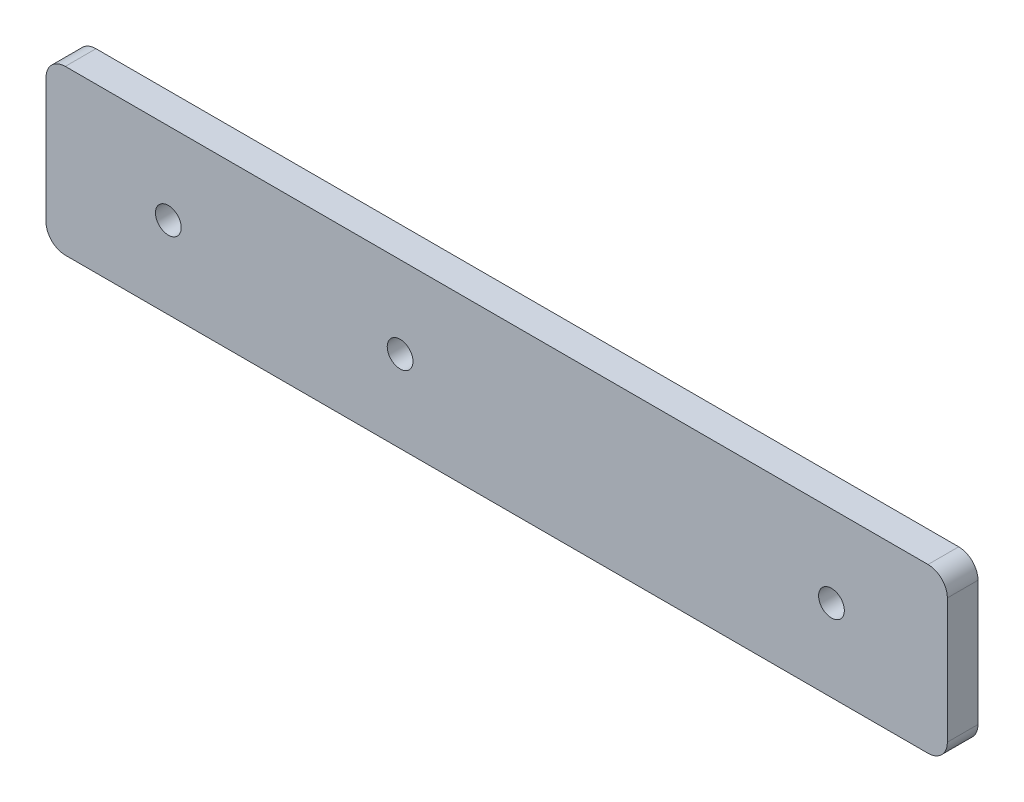
ISO-10303-21;
HEADER;
FILE_DESCRIPTION(('STEP AP214'),'2;1');
FILE_NAME('part.step','',(''),(''),'','','');
FILE_SCHEMA(('AUTOMOTIVE_DESIGN { 1 0 10303 214 1 1 1 1 }'));
ENDSEC;
DATA;
#1=APPLICATION_CONTEXT('core data for automotive mechanical design processes');
#2=APPLICATION_PROTOCOL_DEFINITION('international standard','automotive_design',2000,#1);
#3=PRODUCT_CONTEXT('',#1,'mechanical');
#4=PRODUCT('Part','Part','',(#3));
#5=PRODUCT_RELATED_PRODUCT_CATEGORY('part','',(#4));
#6=PRODUCT_DEFINITION_FORMATION('','',#4);
#7=PRODUCT_DEFINITION_CONTEXT('part definition',#1,'design');
#8=PRODUCT_DEFINITION('design','',#6,#7);
#9=PRODUCT_DEFINITION_SHAPE('','',#8);
#10=(LENGTH_UNIT() NAMED_UNIT(*) SI_UNIT(.MILLI.,.METRE.));
#11=(NAMED_UNIT(*) PLANE_ANGLE_UNIT() SI_UNIT($,.RADIAN.));
#12=(NAMED_UNIT(*) SI_UNIT($,.STERADIAN.) SOLID_ANGLE_UNIT());
#13=UNCERTAINTY_MEASURE_WITH_UNIT(LENGTH_MEASURE(1.E-05),#10,'distance_accuracy_value','');
#14=(GEOMETRIC_REPRESENTATION_CONTEXT(3) GLOBAL_UNCERTAINTY_ASSIGNED_CONTEXT((#13)) GLOBAL_UNIT_ASSIGNED_CONTEXT((#10,
#11,#12)) REPRESENTATION_CONTEXT('',''));
#15=CARTESIAN_POINT('',(0.,0.,0.));
#16=DIRECTION('',(0.,0.,1.));
#17=DIRECTION('',(1.,0.,0.));
#18=AXIS2_PLACEMENT_3D('',#15,#16,#17);
#19=CARTESIAN_POINT('',(0.,0.,3.));
#20=DIRECTION('',(0.,0.,-1.));
#21=DIRECTION('',(-1.,0.,0.));
#22=AXIS2_PLACEMENT_3D('',#19,#20,#21);
#23=PLANE('',#22);
#24=CARTESIAN_POINT('',(52.,0.,3.));
#25=DIRECTION('',(0.,0.,-1.));
#26=DIRECTION('',(-1.,0.,0.));
#27=AXIS2_PLACEMENT_3D('',#24,#25,#26);
#28=CIRCLE('',#27,2.);
#29=CARTESIAN_POINT('',(50.,0.,3.));
#30=VERTEX_POINT('',#29);
#31=EDGE_CURVE('E134',#30,#30,#28,.T.);
#32=ORIENTED_EDGE('',*,*,#31,.T.);
#33=EDGE_LOOP('',(#32));
#34=FACE_BOUND('',#33,.T.);
#35=CARTESIAN_POINT('',(-15.,0.,3.));
#36=DIRECTION('',(0.,0.,-1.));
#37=DIRECTION('',(-1.,0.,0.));
#38=AXIS2_PLACEMENT_3D('',#35,#36,#37);
#39=CIRCLE('',#38,2.);
#40=CARTESIAN_POINT('',(-17.,0.,3.));
#41=VERTEX_POINT('',#40);
#42=EDGE_CURVE('E137',#41,#41,#39,.T.);
#43=ORIENTED_EDGE('',*,*,#42,.T.);
#44=EDGE_LOOP('',(#43));
#45=FACE_BOUND('',#44,.T.);
#46=CARTESIAN_POINT('',(-51.,0.,3.));
#47=DIRECTION('',(0.,0.,-1.));
#48=DIRECTION('',(-1.,0.,0.));
#49=AXIS2_PLACEMENT_3D('',#46,#47,#48);
#50=CIRCLE('',#49,2.);
#51=CARTESIAN_POINT('',(-53.,0.,3.));
#52=VERTEX_POINT('',#51);
#53=EDGE_CURVE('E140',#52,#52,#50,.T.);
#54=ORIENTED_EDGE('',*,*,#53,.T.);
#55=EDGE_LOOP('',(#54));
#56=FACE_BOUND('',#55,.T.);
#57=CARTESIAN_POINT('',(67.,-9.7,3.));
#58=DIRECTION('',(0.,0.,1.));
#59=DIRECTION('',(1.,0.,0.));
#60=AXIS2_PLACEMENT_3D('',#57,#58,#59);
#61=CIRCLE('',#60,3.);
#62=CARTESIAN_POINT('',(70.,-9.7,3.));
#63=VERTEX_POINT('',#62);
#64=CARTESIAN_POINT('',(67.,-12.7,3.));
#65=VERTEX_POINT('',#64);
#66=EDGE_CURVE('E19',#63,#65,#61,.F.);
#67=ORIENTED_EDGE('',*,*,#66,.F.);
#68=DIRECTION('',(0.,1.,0.));
#69=VECTOR('',#68,1.);
#70=CARTESIAN_POINT('',(70.,-12.7,3.));
#71=LINE('',#70,#69);
#72=CARTESIAN_POINT('',(70.,9.7,3.));
#73=VERTEX_POINT('',#72);
#74=EDGE_CURVE('E77',#63,#73,#71,.T.);
#75=ORIENTED_EDGE('',*,*,#74,.T.);
#76=CARTESIAN_POINT('',(67.,9.7,3.));
#77=DIRECTION('',(0.,0.,1.));
#78=DIRECTION('',(1.,0.,0.));
#79=AXIS2_PLACEMENT_3D('',#76,#77,#78);
#80=CIRCLE('',#79,3.);
#81=CARTESIAN_POINT('',(67.,12.7,3.));
#82=VERTEX_POINT('',#81);
#83=EDGE_CURVE('E144',#82,#73,#80,.F.);
#84=ORIENTED_EDGE('',*,*,#83,.F.);
#85=DIRECTION('',(1.,0.,0.));
#86=VECTOR('',#85,1.);
#87=CARTESIAN_POINT('',(-70.,12.7,3.));
#88=LINE('',#87,#86);
#89=CARTESIAN_POINT('',(-67.,12.7,3.));
#90=VERTEX_POINT('',#89);
#91=EDGE_CURVE('E108',#82,#90,#88,.F.);
#92=ORIENTED_EDGE('',*,*,#91,.T.);
#93=CARTESIAN_POINT('',(-67.,9.7,3.));
#94=DIRECTION('',(0.,0.,1.));
#95=DIRECTION('',(1.,0.,0.));
#96=AXIS2_PLACEMENT_3D('',#93,#94,#95);
#97=CIRCLE('',#96,3.);
#98=CARTESIAN_POINT('',(-70.,9.7,3.));
#99=VERTEX_POINT('',#98);
#100=EDGE_CURVE('E111',#99,#90,#97,.F.);
#101=ORIENTED_EDGE('',*,*,#100,.F.);
#102=DIRECTION('',(0.,1.,0.));
#103=VECTOR('',#102,1.);
#104=CARTESIAN_POINT('',(-70.,-12.7,3.));
#105=LINE('',#104,#103);
#106=CARTESIAN_POINT('',(-70.,-9.7,3.));
#107=VERTEX_POINT('',#106);
#108=EDGE_CURVE('E112',#99,#107,#105,.F.);
#109=ORIENTED_EDGE('',*,*,#108,.T.);
#110=CARTESIAN_POINT('',(-67.,-9.7,3.));
#111=DIRECTION('',(0.,0.,1.));
#112=DIRECTION('',(1.,0.,0.));
#113=AXIS2_PLACEMENT_3D('',#110,#111,#112);
#114=CIRCLE('',#113,3.);
#115=CARTESIAN_POINT('',(-67.,-12.7,3.));
#116=VERTEX_POINT('',#115);
#117=EDGE_CURVE('E86',#116,#107,#114,.F.);
#118=ORIENTED_EDGE('',*,*,#117,.F.);
#119=DIRECTION('',(1.,0.,0.));
#120=VECTOR('',#119,1.);
#121=CARTESIAN_POINT('',(-70.,-12.7,3.));
#122=LINE('',#121,#120);
#123=EDGE_CURVE('E82',#116,#65,#122,.T.);
#124=ORIENTED_EDGE('',*,*,#123,.T.);
#125=EDGE_LOOP('',(#67,#75,#84,#92,#101,#109,#118,#124));
#126=FACE_BOUND('',#125,.T.);
#127=ADVANCED_FACE('F16',(#34,#45,#56,#126),#23,.F.);
#128=CARTESIAN_POINT('',(70.,-12.7,3.));
#129=DIRECTION('',(-1.,0.,0.));
#130=DIRECTION('',(0.,0.,1.));
#131=AXIS2_PLACEMENT_3D('',#128,#129,#130);
#132=PLANE('',#131);
#133=DIRECTION('',(0.,0.,1.));
#134=VECTOR('',#133,1.);
#135=CARTESIAN_POINT('',(70.,-9.7,3.));
#136=LINE('',#135,#134);
#137=CARTESIAN_POINT('',(70.,-9.7,-1.76));
#138=VERTEX_POINT('',#137);
#139=EDGE_CURVE('E96',#138,#63,#136,.T.);
#140=ORIENTED_EDGE('',*,*,#139,.F.);
#141=DIRECTION('',(0.,1.,0.));
#142=VECTOR('',#141,1.);
#143=CARTESIAN_POINT('',(70.,0.,-1.76));
#144=LINE('',#143,#142);
#145=CARTESIAN_POINT('',(70.,9.7,-1.76));
#146=VERTEX_POINT('',#145);
#147=EDGE_CURVE('E133',#146,#138,#144,.F.);
#148=ORIENTED_EDGE('',*,*,#147,.F.);
#149=DIRECTION('',(0.,0.,1.));
#150=VECTOR('',#149,1.);
#151=CARTESIAN_POINT('',(70.,9.7,3.));
#152=LINE('',#151,#150);
#153=EDGE_CURVE('E143',#73,#146,#152,.F.);
#154=ORIENTED_EDGE('',*,*,#153,.F.);
#155=ORIENTED_EDGE('',*,*,#74,.F.);
#156=EDGE_LOOP('',(#140,#148,#154,#155));
#157=FACE_BOUND('',#156,.T.);
#158=ADVANCED_FACE('F180',(#157),#132,.F.);
#159=CARTESIAN_POINT('',(67.,-9.7,3.));
#160=DIRECTION('',(0.,0.,1.));
#161=DIRECTION('',(1.,0.,0.));
#162=AXIS2_PLACEMENT_3D('',#159,#160,#161);
#163=CYLINDRICAL_SURFACE('',#162,3.);
#164=ORIENTED_EDGE('',*,*,#66,.T.);
#165=DIRECTION('',(0.,0.,1.));
#166=VECTOR('',#165,1.);
#167=CARTESIAN_POINT('',(67.,-12.7,3.));
#168=LINE('',#167,#166);
#169=CARTESIAN_POINT('',(67.,-12.7,-1.76));
#170=VERTEX_POINT('',#169);
#171=EDGE_CURVE('E90',#65,#170,#168,.F.);
#172=ORIENTED_EDGE('',*,*,#171,.T.);
#173=CARTESIAN_POINT('',(67.,-9.7,-1.76));
#174=DIRECTION('',(0.,0.,1.));
#175=DIRECTION('',(1.,0.,0.));
#176=AXIS2_PLACEMENT_3D('',#173,#174,#175);
#177=CIRCLE('',#176,3.);
#178=EDGE_CURVE('E131',#138,#170,#177,.F.);
#179=ORIENTED_EDGE('',*,*,#178,.F.);
#180=ORIENTED_EDGE('',*,*,#139,.T.);
#181=EDGE_LOOP('',(#164,#172,#179,#180));
#182=FACE_BOUND('',#181,.T.);
#183=ADVANCED_FACE('F93',(#182),#163,.T.);
#184=CARTESIAN_POINT('',(-70.,-12.7,3.));
#185=DIRECTION('',(0.,1.,0.));
#186=DIRECTION('',(0.,0.,1.));
#187=AXIS2_PLACEMENT_3D('',#184,#185,#186);
#188=PLANE('',#187);
#189=ORIENTED_EDGE('',*,*,#171,.F.);
#190=ORIENTED_EDGE('',*,*,#123,.F.);
#191=DIRECTION('',(0.,0.,1.));
#192=VECTOR('',#191,1.);
#193=CARTESIAN_POINT('',(-67.,-12.7,3.));
#194=LINE('',#193,#192);
#195=CARTESIAN_POINT('',(-67.,-12.7,-1.76));
#196=VERTEX_POINT('',#195);
#197=EDGE_CURVE('E101',#196,#116,#194,.T.);
#198=ORIENTED_EDGE('',*,*,#197,.F.);
#199=DIRECTION('',(-1.,0.,0.));
#200=VECTOR('',#199,1.);
#201=CARTESIAN_POINT('',(0.,-12.7,-1.76));
#202=LINE('',#201,#200);
#203=EDGE_CURVE('E99',#170,#196,#202,.T.);
#204=ORIENTED_EDGE('',*,*,#203,.F.);
#205=EDGE_LOOP('',(#189,#190,#198,#204));
#206=FACE_BOUND('',#205,.T.);
#207=ADVANCED_FACE('F97',(#206),#188,.F.);
#208=CARTESIAN_POINT('',(-67.,-9.7,3.));
#209=DIRECTION('',(0.,0.,1.));
#210=DIRECTION('',(1.,0.,0.));
#211=AXIS2_PLACEMENT_3D('',#208,#209,#210);
#212=CYLINDRICAL_SURFACE('',#211,3.);
#213=ORIENTED_EDGE('',*,*,#117,.T.);
#214=DIRECTION('',(0.,0.,-1.));
#215=VECTOR('',#214,1.);
#216=CARTESIAN_POINT('',(-70.,-9.7,3.));
#217=LINE('',#216,#215);
#218=CARTESIAN_POINT('',(-70.,-9.7,-1.76));
#219=VERTEX_POINT('',#218);
#220=EDGE_CURVE('E113',#107,#219,#217,.T.);
#221=ORIENTED_EDGE('',*,*,#220,.T.);
#222=CARTESIAN_POINT('',(-67.,-9.7,-1.76));
#223=DIRECTION('',(0.,0.,1.));
#224=DIRECTION('',(1.,0.,0.));
#225=AXIS2_PLACEMENT_3D('',#222,#223,#224);
#226=CIRCLE('',#225,3.);
#227=EDGE_CURVE('E128',#196,#219,#226,.F.);
#228=ORIENTED_EDGE('',*,*,#227,.F.);
#229=ORIENTED_EDGE('',*,*,#197,.T.);
#230=EDGE_LOOP('',(#213,#221,#228,#229));
#231=FACE_BOUND('',#230,.T.);
#232=ADVANCED_FACE('F151',(#231),#212,.T.);
#233=CARTESIAN_POINT('',(-70.,-12.7,3.));
#234=DIRECTION('',(1.,0.,0.));
#235=DIRECTION('',(0.,0.,-1.));
#236=AXIS2_PLACEMENT_3D('',#233,#234,#235);
#237=PLANE('',#236);
#238=ORIENTED_EDGE('',*,*,#220,.F.);
#239=ORIENTED_EDGE('',*,*,#108,.F.);
#240=DIRECTION('',(0.,0.,1.));
#241=VECTOR('',#240,1.);
#242=CARTESIAN_POINT('',(-70.,9.7,3.));
#243=LINE('',#242,#241);
#244=CARTESIAN_POINT('',(-70.,9.7,-1.76));
#245=VERTEX_POINT('',#244);
#246=EDGE_CURVE('E148',#245,#99,#243,.T.);
#247=ORIENTED_EDGE('',*,*,#246,.F.);
#248=DIRECTION('',(0.,1.,0.));
#249=VECTOR('',#248,1.);
#250=CARTESIAN_POINT('',(-70.,0.,-1.76));
#251=LINE('',#250,#249);
#252=EDGE_CURVE('E127',#219,#245,#251,.T.);
#253=ORIENTED_EDGE('',*,*,#252,.F.);
#254=EDGE_LOOP('',(#238,#239,#247,#253));
#255=FACE_BOUND('',#254,.T.);
#256=ADVANCED_FACE('F155',(#255),#237,.F.);
#257=CARTESIAN_POINT('',(-67.,9.7,3.));
#258=DIRECTION('',(0.,0.,1.));
#259=DIRECTION('',(1.,0.,0.));
#260=AXIS2_PLACEMENT_3D('',#257,#258,#259);
#261=CYLINDRICAL_SURFACE('',#260,3.);
#262=ORIENTED_EDGE('',*,*,#100,.T.);
#263=DIRECTION('',(0.,0.,-1.));
#264=VECTOR('',#263,1.);
#265=CARTESIAN_POINT('',(-67.,12.7,3.));
#266=LINE('',#265,#264);
#267=CARTESIAN_POINT('',(-67.,12.7,-1.76));
#268=VERTEX_POINT('',#267);
#269=EDGE_CURVE('E110',#90,#268,#266,.T.);
#270=ORIENTED_EDGE('',*,*,#269,.T.);
#271=CARTESIAN_POINT('',(-67.,9.7,-1.76));
#272=DIRECTION('',(0.,0.,1.));
#273=DIRECTION('',(1.,0.,0.));
#274=AXIS2_PLACEMENT_3D('',#271,#272,#273);
#275=CIRCLE('',#274,3.);
#276=EDGE_CURVE('E124',#245,#268,#275,.F.);
#277=ORIENTED_EDGE('',*,*,#276,.F.);
#278=ORIENTED_EDGE('',*,*,#246,.T.);
#279=EDGE_LOOP('',(#262,#270,#277,#278));
#280=FACE_BOUND('',#279,.T.);
#281=ADVANCED_FACE('F177',(#280),#261,.T.);
#282=CARTESIAN_POINT('',(-70.,12.7,3.));
#283=DIRECTION('',(0.,-1.,0.));
#284=DIRECTION('',(0.,0.,-1.));
#285=AXIS2_PLACEMENT_3D('',#282,#283,#284);
#286=PLANE('',#285);
#287=ORIENTED_EDGE('',*,*,#269,.F.);
#288=ORIENTED_EDGE('',*,*,#91,.F.);
#289=DIRECTION('',(0.,0.,1.));
#290=VECTOR('',#289,1.);
#291=CARTESIAN_POINT('',(67.,12.7,3.));
#292=LINE('',#291,#290);
#293=CARTESIAN_POINT('',(67.,12.7,-1.76));
#294=VERTEX_POINT('',#293);
#295=EDGE_CURVE('E34',#294,#82,#292,.T.);
#296=ORIENTED_EDGE('',*,*,#295,.F.);
#297=DIRECTION('',(-1.,0.,0.));
#298=VECTOR('',#297,1.);
#299=CARTESIAN_POINT('',(0.,12.7,-1.76));
#300=LINE('',#299,#298);
#301=EDGE_CURVE('E123',#268,#294,#300,.F.);
#302=ORIENTED_EDGE('',*,*,#301,.F.);
#303=EDGE_LOOP('',(#287,#288,#296,#302));
#304=FACE_BOUND('',#303,.T.);
#305=ADVANCED_FACE('F174',(#304),#286,.F.);
#306=CARTESIAN_POINT('',(67.,9.7,3.));
#307=DIRECTION('',(0.,0.,1.));
#308=DIRECTION('',(1.,0.,0.));
#309=AXIS2_PLACEMENT_3D('',#306,#307,#308);
#310=CYLINDRICAL_SURFACE('',#309,3.);
#311=ORIENTED_EDGE('',*,*,#83,.T.);
#312=ORIENTED_EDGE('',*,*,#153,.T.);
#313=CARTESIAN_POINT('',(67.,9.7,-1.76));
#314=DIRECTION('',(0.,0.,1.));
#315=DIRECTION('',(1.,0.,0.));
#316=AXIS2_PLACEMENT_3D('',#313,#314,#315);
#317=CIRCLE('',#316,3.);
#318=EDGE_CURVE('E120',#294,#146,#317,.F.);
#319=ORIENTED_EDGE('',*,*,#318,.F.);
#320=ORIENTED_EDGE('',*,*,#295,.T.);
#321=EDGE_LOOP('',(#311,#312,#319,#320));
#322=FACE_BOUND('',#321,.T.);
#323=ADVANCED_FACE('F179',(#322),#310,.T.);
#324=CARTESIAN_POINT('',(-51.,0.,3.));
#325=DIRECTION('',(0.,0.,-1.));
#326=DIRECTION('',(-1.,0.,0.));
#327=AXIS2_PLACEMENT_3D('',#324,#325,#326);
#328=CYLINDRICAL_SURFACE('',#327,2.);
#329=ORIENTED_EDGE('',*,*,#53,.F.);
#330=EDGE_LOOP('',(#329));
#331=FACE_BOUND('',#330,.T.);
#332=CARTESIAN_POINT('',(-51.,0.,-1.76));
#333=DIRECTION('',(0.,0.,-1.));
#334=DIRECTION('',(-1.,0.,0.));
#335=AXIS2_PLACEMENT_3D('',#332,#333,#334);
#336=CIRCLE('',#335,2.);
#337=CARTESIAN_POINT('',(-53.,0.,-1.76));
#338=VERTEX_POINT('',#337);
#339=EDGE_CURVE('E117',#338,#338,#336,.F.);
#340=ORIENTED_EDGE('',*,*,#339,.F.);
#341=EDGE_LOOP('',(#340));
#342=FACE_BOUND('',#341,.T.);
#343=ADVANCED_FACE('F203',(#331,#342),#328,.F.);
#344=CARTESIAN_POINT('',(-15.,0.,3.));
#345=DIRECTION('',(0.,0.,-1.));
#346=DIRECTION('',(-1.,0.,0.));
#347=AXIS2_PLACEMENT_3D('',#344,#345,#346);
#348=CYLINDRICAL_SURFACE('',#347,2.);
#349=ORIENTED_EDGE('',*,*,#42,.F.);
#350=EDGE_LOOP('',(#349));
#351=FACE_BOUND('',#350,.T.);
#352=CARTESIAN_POINT('',(-15.,0.,-1.76));
#353=DIRECTION('',(0.,0.,-1.));
#354=DIRECTION('',(-1.,0.,0.));
#355=AXIS2_PLACEMENT_3D('',#352,#353,#354);
#356=CIRCLE('',#355,2.);
#357=CARTESIAN_POINT('',(-17.,0.,-1.76));
#358=VERTEX_POINT('',#357);
#359=EDGE_CURVE('E25',#358,#358,#356,.F.);
#360=ORIENTED_EDGE('',*,*,#359,.F.);
#361=EDGE_LOOP('',(#360));
#362=FACE_BOUND('',#361,.T.);
#363=ADVANCED_FACE('F196',(#351,#362),#348,.F.);
#364=CARTESIAN_POINT('',(52.,0.,3.));
#365=DIRECTION('',(0.,0.,-1.));
#366=DIRECTION('',(-1.,0.,0.));
#367=AXIS2_PLACEMENT_3D('',#364,#365,#366);
#368=CYLINDRICAL_SURFACE('',#367,2.);
#369=ORIENTED_EDGE('',*,*,#31,.F.);
#370=EDGE_LOOP('',(#369));
#371=FACE_BOUND('',#370,.T.);
#372=CARTESIAN_POINT('',(52.,0.,-1.76));
#373=DIRECTION('',(0.,0.,-1.));
#374=DIRECTION('',(-1.,0.,0.));
#375=AXIS2_PLACEMENT_3D('',#372,#373,#374);
#376=CIRCLE('',#375,2.);
#377=CARTESIAN_POINT('',(50.,0.,-1.76));
#378=VERTEX_POINT('',#377);
#379=EDGE_CURVE('E11',#378,#378,#376,.F.);
#380=ORIENTED_EDGE('',*,*,#379,.F.);
#381=EDGE_LOOP('',(#380));
#382=FACE_BOUND('',#381,.T.);
#383=ADVANCED_FACE('F190',(#371,#382),#368,.F.);
#384=CARTESIAN_POINT('',(0.,0.,-1.76));
#385=DIRECTION('',(0.,0.,-1.));
#386=DIRECTION('',(-1.,0.,0.));
#387=AXIS2_PLACEMENT_3D('',#384,#385,#386);
#388=PLANE('',#387);
#389=ORIENTED_EDGE('',*,*,#379,.T.);
#390=EDGE_LOOP('',(#389));
#391=FACE_BOUND('',#390,.T.);
#392=ORIENTED_EDGE('',*,*,#359,.T.);
#393=EDGE_LOOP('',(#392));
#394=FACE_BOUND('',#393,.T.);
#395=ORIENTED_EDGE('',*,*,#339,.T.);
#396=EDGE_LOOP('',(#395));
#397=FACE_BOUND('',#396,.T.);
#398=ORIENTED_EDGE('',*,*,#301,.T.);
#399=ORIENTED_EDGE('',*,*,#318,.T.);
#400=ORIENTED_EDGE('',*,*,#147,.T.);
#401=ORIENTED_EDGE('',*,*,#178,.T.);
#402=ORIENTED_EDGE('',*,*,#203,.T.);
#403=ORIENTED_EDGE('',*,*,#227,.T.);
#404=ORIENTED_EDGE('',*,*,#252,.T.);
#405=ORIENTED_EDGE('',*,*,#276,.T.);
#406=EDGE_LOOP('',(#398,#399,#400,#401,#402,#403,#404,#405));
#407=FACE_BOUND('',#406,.T.);
#408=ADVANCED_FACE('F171',(#391,#394,#397,#407),#388,.T.);
#409=CLOSED_SHELL('',(#127,#158,#183,#207,#232,#256,#281,#305,#323,#343,#363,#383,#408));
#410=MANIFOLD_SOLID_BREP('B1',#409);
#411=ADVANCED_BREP_SHAPE_REPRESENTATION('',(#18,#410),#14);
#412=SHAPE_DEFINITION_REPRESENTATION(#9,#411);
ENDSEC;
END-ISO-10303-21;
